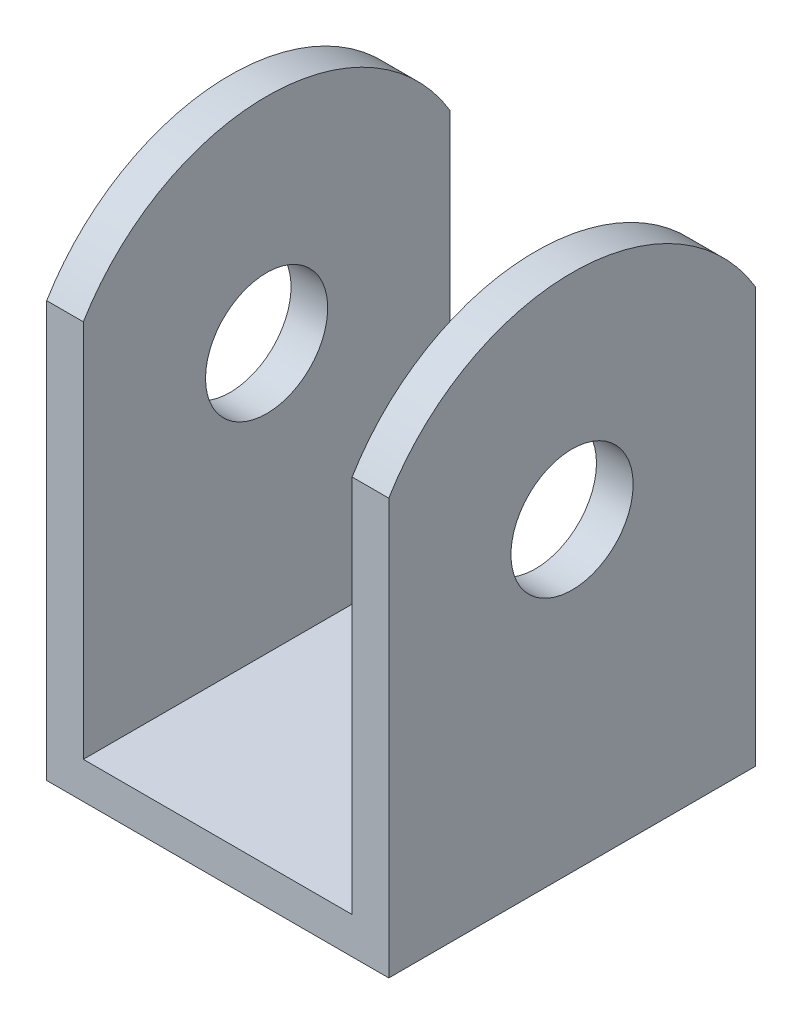
ISO-10303-21;
HEADER;
FILE_DESCRIPTION(('STEP AP214'),'2;1');
FILE_NAME('part.step','',(''),(''),'','','');
FILE_SCHEMA(('AUTOMOTIVE_DESIGN { 1 0 10303 214 1 1 1 1 }'));
ENDSEC;
DATA;
#1=APPLICATION_CONTEXT('core data for automotive mechanical design processes');
#2=APPLICATION_PROTOCOL_DEFINITION('international standard','automotive_design',2000,#1);
#3=PRODUCT_CONTEXT('',#1,'mechanical');
#4=PRODUCT('Part','Part','',(#3));
#5=PRODUCT_RELATED_PRODUCT_CATEGORY('part','',(#4));
#6=PRODUCT_DEFINITION_FORMATION('','',#4);
#7=PRODUCT_DEFINITION_CONTEXT('part definition',#1,'design');
#8=PRODUCT_DEFINITION('design','',#6,#7);
#9=PRODUCT_DEFINITION_SHAPE('','',#8);
#10=(LENGTH_UNIT() NAMED_UNIT(*) SI_UNIT(.MILLI.,.METRE.));
#11=(NAMED_UNIT(*) PLANE_ANGLE_UNIT() SI_UNIT($,.RADIAN.));
#12=(NAMED_UNIT(*) SI_UNIT($,.STERADIAN.) SOLID_ANGLE_UNIT());
#13=UNCERTAINTY_MEASURE_WITH_UNIT(LENGTH_MEASURE(1.E-05),#10,'distance_accuracy_value','');
#14=(GEOMETRIC_REPRESENTATION_CONTEXT(3) GLOBAL_UNCERTAINTY_ASSIGNED_CONTEXT((#13)) GLOBAL_UNIT_ASSIGNED_CONTEXT((#10,
#11,#12)) REPRESENTATION_CONTEXT('',''));
#15=CARTESIAN_POINT('',(0.,0.,0.));
#16=DIRECTION('',(0.,0.,1.));
#17=DIRECTION('',(1.,0.,0.));
#18=AXIS2_PLACEMENT_3D('',#15,#16,#17);
#19=CARTESIAN_POINT('',(0.,3.,0.));
#20=DIRECTION('',(0.,1.,0.));
#21=DIRECTION('',(0.,0.,1.));
#22=AXIS2_PLACEMENT_3D('',#19,#20,#21);
#23=PLANE('',#22);
#24=DIRECTION('',(-1.,0.,0.));
#25=VECTOR('',#24,1.);
#26=CARTESIAN_POINT('',(0.,3.,15.0813953488372));
#27=LINE('',#26,#25);
#28=CARTESIAN_POINT('',(-34.1860465116279,3.,15.0813953488372));
#29=VERTEX_POINT('',#28);
#30=CARTESIAN_POINT('',(-56.1860465116279,3.,15.0813953488372));
#31=VERTEX_POINT('',#30);
#32=EDGE_CURVE('E68',#29,#31,#27,.T.);
#33=ORIENTED_EDGE('',*,*,#32,.F.);
#34=DIRECTION('',(0.,0.,-1.));
#35=VECTOR('',#34,1.);
#36=CARTESIAN_POINT('',(-34.186046511628,3.,-17.4186046511628));
#37=LINE('',#36,#35);
#38=CARTESIAN_POINT('',(-34.1860465116279,3.,-14.9186046511628));
#39=VERTEX_POINT('',#38);
#40=EDGE_CURVE('E164',#29,#39,#37,.T.);
#41=ORIENTED_EDGE('',*,*,#40,.T.);
#42=DIRECTION('',(1.,0.,0.));
#43=VECTOR('',#42,1.);
#44=CARTESIAN_POINT('',(0.,3.,-14.9186046511628));
#45=LINE('',#44,#43);
#46=CARTESIAN_POINT('',(-56.186046511628,3.,-14.9186046511628));
#47=VERTEX_POINT('',#46);
#48=EDGE_CURVE('E200',#47,#39,#45,.T.);
#49=ORIENTED_EDGE('',*,*,#48,.F.);
#50=DIRECTION('',(0.,0.,1.));
#51=VECTOR('',#50,1.);
#52=CARTESIAN_POINT('',(-56.186046511628,3.,-17.4186046511628));
#53=LINE('',#52,#51);
#54=EDGE_CURVE('E157',#47,#31,#53,.T.);
#55=ORIENTED_EDGE('',*,*,#54,.T.);
#56=EDGE_LOOP('',(#33,#41,#49,#55));
#57=FACE_BOUND('',#56,.T.);
#58=ADVANCED_FACE('F45',(#57),#23,.T.);
#59=CARTESIAN_POINT('',(0.,0.,0.));
#60=DIRECTION('',(0.,1.,0.));
#61=DIRECTION('',(0.,0.,1.));
#62=AXIS2_PLACEMENT_3D('',#59,#60,#61);
#63=PLANE('',#62);
#64=DIRECTION('',(0.,0.,-1.));
#65=VECTOR('',#64,1.);
#66=CARTESIAN_POINT('',(-31.186046511628,0.,0.));
#67=LINE('',#66,#65);
#68=CARTESIAN_POINT('',(-31.1860465116279,0.,15.0813953488372));
#69=VERTEX_POINT('',#68);
#70=CARTESIAN_POINT('',(-31.186046511628,0.,-14.9186046511628));
#71=VERTEX_POINT('',#70);
#72=EDGE_CURVE('E126',#69,#71,#67,.T.);
#73=ORIENTED_EDGE('',*,*,#72,.F.);
#74=DIRECTION('',(1.,0.,0.));
#75=VECTOR('',#74,1.);
#76=CARTESIAN_POINT('',(-59.186046511628,0.,15.0813953488372));
#77=LINE('',#76,#75);
#78=CARTESIAN_POINT('',(-59.186046511628,0.,15.0813953488372));
#79=VERTEX_POINT('',#78);
#80=EDGE_CURVE('E110',#79,#69,#77,.T.);
#81=ORIENTED_EDGE('',*,*,#80,.F.);
#82=DIRECTION('',(0.,0.,1.));
#83=VECTOR('',#82,1.);
#84=CARTESIAN_POINT('',(-59.186046511628,0.,0.));
#85=LINE('',#84,#83);
#86=CARTESIAN_POINT('',(-59.186046511628,0.,-14.9186046511628));
#87=VERTEX_POINT('',#86);
#88=EDGE_CURVE('E124',#87,#79,#85,.T.);
#89=ORIENTED_EDGE('',*,*,#88,.F.);
#90=DIRECTION('',(-1.,0.,0.));
#91=VECTOR('',#90,1.);
#92=CARTESIAN_POINT('',(-59.186046511628,0.,-14.9186046511628));
#93=LINE('',#92,#91);
#94=EDGE_CURVE('E127',#71,#87,#93,.T.);
#95=ORIENTED_EDGE('',*,*,#94,.F.);
#96=EDGE_LOOP('',(#73,#81,#89,#95));
#97=FACE_BOUND('',#96,.T.);
#98=ADVANCED_FACE('F47',(#97),#63,.F.);
#99=CARTESIAN_POINT('',(-31.186046511628,25.,0.0813953488372125));
#100=DIRECTION('',(-1.,0.,0.));
#101=DIRECTION('',(0.,0.,1.));
#102=AXIS2_PLACEMENT_3D('',#99,#100,#101);
#103=CYLINDRICAL_SURFACE('',#102,17.5);
#104=CARTESIAN_POINT('',(-34.1860465116279,25.,0.0813953488372137));
#105=DIRECTION('',(1.,0.,0.));
#106=DIRECTION('',(0.,0.,-1.));
#107=AXIS2_PLACEMENT_3D('',#104,#105,#106);
#108=CIRCLE('',#107,17.5);
#109=CARTESIAN_POINT('',(-34.186046511628,34.01387818866,-14.9186046511628));
#110=VERTEX_POINT('',#109);
#111=CARTESIAN_POINT('',(-34.1860465116279,34.01387818866,15.0813953488372));
#112=VERTEX_POINT('',#111);
#113=EDGE_CURVE('E137',#110,#112,#108,.T.);
#114=ORIENTED_EDGE('',*,*,#113,.T.);
#115=DIRECTION('',(-1.,0.,0.));
#116=VECTOR('',#115,1.);
#117=CARTESIAN_POINT('',(-31.186046511628,34.01387818866,15.0813953488372));
#118=LINE('',#117,#116);
#119=CARTESIAN_POINT('',(-31.1860465116279,34.01387818866,15.0813953488372));
#120=VERTEX_POINT('',#119);
#121=EDGE_CURVE('E146',#112,#120,#118,.F.);
#122=ORIENTED_EDGE('',*,*,#121,.T.);
#123=CARTESIAN_POINT('',(-31.186046511628,25.,0.0813953488372125));
#124=DIRECTION('',(1.,0.,0.));
#125=DIRECTION('',(0.,0.,-1.));
#126=AXIS2_PLACEMENT_3D('',#123,#124,#125);
#127=CIRCLE('',#126,17.5);
#128=CARTESIAN_POINT('',(-31.186046511628,34.01387818866,-14.9186046511628));
#129=VERTEX_POINT('',#128);
#130=EDGE_CURVE('E149',#129,#120,#127,.T.);
#131=ORIENTED_EDGE('',*,*,#130,.F.);
#132=DIRECTION('',(-1.,0.,0.));
#133=VECTOR('',#132,1.);
#134=CARTESIAN_POINT('',(-31.186046511628,34.01387818866,-14.9186046511628));
#135=LINE('',#134,#133);
#136=EDGE_CURVE('E174',#129,#110,#135,.T.);
#137=ORIENTED_EDGE('',*,*,#136,.T.);
#138=EDGE_LOOP('',(#114,#122,#131,#137));
#139=FACE_BOUND('',#138,.T.);
#140=ADVANCED_FACE('F187',(#139),#103,.T.);
#141=CARTESIAN_POINT('',(-31.186046511628,25.,0.0813953488372125));
#142=DIRECTION('',(-1.,0.,0.));
#143=DIRECTION('',(0.,0.,1.));
#144=AXIS2_PLACEMENT_3D('',#141,#142,#143);
#145=CYLINDRICAL_SURFACE('',#144,5.);
#146=CARTESIAN_POINT('',(-31.186046511628,25.,0.0813953488372125));
#147=DIRECTION('',(1.,0.,0.));
#148=DIRECTION('',(0.,0.,-1.));
#149=AXIS2_PLACEMENT_3D('',#146,#147,#148);
#150=CIRCLE('',#149,5.);
#151=CARTESIAN_POINT('',(-31.186046511628,25.,-4.91860465116279));
#152=VERTEX_POINT('',#151);
#153=EDGE_CURVE('E154',#152,#152,#150,.T.);
#154=ORIENTED_EDGE('',*,*,#153,.T.);
#155=EDGE_LOOP('',(#154));
#156=FACE_BOUND('',#155,.T.);
#157=CARTESIAN_POINT('',(-34.1860465116279,25.,0.0813953488372137));
#158=DIRECTION('',(1.,0.,0.));
#159=DIRECTION('',(0.,0.,-1.));
#160=AXIS2_PLACEMENT_3D('',#157,#158,#159);
#161=CIRCLE('',#160,5.);
#162=CARTESIAN_POINT('',(-34.1860465116279,25.,-4.91860465116279));
#163=VERTEX_POINT('',#162);
#164=EDGE_CURVE('E152',#163,#163,#161,.T.);
#165=ORIENTED_EDGE('',*,*,#164,.F.);
#166=EDGE_LOOP('',(#165));
#167=FACE_BOUND('',#166,.T.);
#168=ADVANCED_FACE('F225',(#156,#167),#145,.F.);
#169=CARTESIAN_POINT('',(-31.186046511628,0.,0.));
#170=DIRECTION('',(1.,0.,0.));
#171=DIRECTION('',(0.,0.,-1.));
#172=AXIS2_PLACEMENT_3D('',#169,#170,#171);
#173=PLANE('',#172);
#174=DIRECTION('',(0.,-1.,0.));
#175=VECTOR('',#174,1.);
#176=CARTESIAN_POINT('',(-31.1860465116279,50.,15.0813953488372));
#177=LINE('',#176,#175);
#178=EDGE_CURVE('E118',#120,#69,#177,.T.);
#179=ORIENTED_EDGE('',*,*,#178,.T.);
#180=ORIENTED_EDGE('',*,*,#72,.T.);
#181=DIRECTION('',(0.,-1.,0.));
#182=VECTOR('',#181,1.);
#183=CARTESIAN_POINT('',(-31.186046511628,50.,-14.9186046511628));
#184=LINE('',#183,#182);
#185=EDGE_CURVE('E193',#129,#71,#184,.T.);
#186=ORIENTED_EDGE('',*,*,#185,.F.);
#187=ORIENTED_EDGE('',*,*,#130,.T.);
#188=EDGE_LOOP('',(#179,#180,#186,#187));
#189=FACE_BOUND('',#188,.T.);
#190=ORIENTED_EDGE('',*,*,#153,.F.);
#191=EDGE_LOOP('',(#190));
#192=FACE_BOUND('',#191,.T.);
#193=ADVANCED_FACE('F191',(#189,#192),#173,.T.);
#194=CARTESIAN_POINT('',(-34.1860465116279,0.,0.));
#195=DIRECTION('',(1.,0.,0.));
#196=DIRECTION('',(0.,0.,-1.));
#197=AXIS2_PLACEMENT_3D('',#194,#195,#196);
#198=PLANE('',#197);
#199=ORIENTED_EDGE('',*,*,#40,.F.);
#200=DIRECTION('',(0.,1.,0.));
#201=VECTOR('',#200,1.);
#202=CARTESIAN_POINT('',(-34.1860465116279,0.,15.0813953488372));
#203=LINE('',#202,#201);
#204=EDGE_CURVE('E176',#29,#112,#203,.T.);
#205=ORIENTED_EDGE('',*,*,#204,.T.);
#206=ORIENTED_EDGE('',*,*,#113,.F.);
#207=DIRECTION('',(0.,-1.,0.));
#208=VECTOR('',#207,1.);
#209=CARTESIAN_POINT('',(-34.186046511628,0.,-14.9186046511628));
#210=LINE('',#209,#208);
#211=EDGE_CURVE('E179',#110,#39,#210,.T.);
#212=ORIENTED_EDGE('',*,*,#211,.T.);
#213=EDGE_LOOP('',(#199,#205,#206,#212));
#214=FACE_BOUND('',#213,.T.);
#215=ORIENTED_EDGE('',*,*,#164,.T.);
#216=EDGE_LOOP('',(#215));
#217=FACE_BOUND('',#216,.T.);
#218=ADVANCED_FACE('F204',(#214,#217),#198,.F.);
#219=CARTESIAN_POINT('',(-59.186046511628,25.,0.0813953488372119));
#220=DIRECTION('',(1.,0.,0.));
#221=DIRECTION('',(0.,0.,-1.));
#222=AXIS2_PLACEMENT_3D('',#219,#220,#221);
#223=CYLINDRICAL_SURFACE('',#222,17.5);
#224=CARTESIAN_POINT('',(-59.186046511628,25.,0.0813953488372119));
#225=DIRECTION('',(-1.,0.,0.));
#226=DIRECTION('',(0.,0.,1.));
#227=AXIS2_PLACEMENT_3D('',#224,#225,#226);
#228=CIRCLE('',#227,17.5);
#229=CARTESIAN_POINT('',(-59.186046511628,34.01387818866,15.0813953488372));
#230=VERTEX_POINT('',#229);
#231=CARTESIAN_POINT('',(-59.186046511628,34.01387818866,-14.9186046511628));
#232=VERTEX_POINT('',#231);
#233=EDGE_CURVE('E134',#230,#232,#228,.T.);
#234=ORIENTED_EDGE('',*,*,#233,.F.);
#235=DIRECTION('',(1.,0.,0.));
#236=VECTOR('',#235,1.);
#237=CARTESIAN_POINT('',(-59.186046511628,34.01387818866,15.0813953488372));
#238=LINE('',#237,#236);
#239=CARTESIAN_POINT('',(-56.186046511628,34.01387818866,15.0813953488372));
#240=VERTEX_POINT('',#239);
#241=EDGE_CURVE('E113',#230,#240,#238,.T.);
#242=ORIENTED_EDGE('',*,*,#241,.T.);
#243=CARTESIAN_POINT('',(-56.186046511628,25.,0.0813953488372113));
#244=DIRECTION('',(-1.,0.,0.));
#245=DIRECTION('',(0.,0.,1.));
#246=AXIS2_PLACEMENT_3D('',#243,#244,#245);
#247=CIRCLE('',#246,17.5);
#248=CARTESIAN_POINT('',(-56.186046511628,34.01387818866,-14.9186046511628));
#249=VERTEX_POINT('',#248);
#250=EDGE_CURVE('E143',#240,#249,#247,.T.);
#251=ORIENTED_EDGE('',*,*,#250,.T.);
#252=DIRECTION('',(1.,0.,0.));
#253=VECTOR('',#252,1.);
#254=CARTESIAN_POINT('',(-59.186046511628,34.01387818866,-14.9186046511628));
#255=LINE('',#254,#253);
#256=EDGE_CURVE('E60',#249,#232,#255,.F.);
#257=ORIENTED_EDGE('',*,*,#256,.T.);
#258=EDGE_LOOP('',(#234,#242,#251,#257));
#259=FACE_BOUND('',#258,.T.);
#260=ADVANCED_FACE('F173',(#259),#223,.T.);
#261=CARTESIAN_POINT('',(-59.186046511628,25.,0.0813953488372119));
#262=DIRECTION('',(1.,0.,0.));
#263=DIRECTION('',(0.,0.,-1.));
#264=AXIS2_PLACEMENT_3D('',#261,#262,#263);
#265=CYLINDRICAL_SURFACE('',#264,5.);
#266=CARTESIAN_POINT('',(-59.186046511628,25.,0.0813953488372119));
#267=DIRECTION('',(-1.,0.,0.));
#268=DIRECTION('',(0.,0.,1.));
#269=AXIS2_PLACEMENT_3D('',#266,#267,#268);
#270=CIRCLE('',#269,5.);
#271=CARTESIAN_POINT('',(-59.186046511628,25.,5.08139534883721));
#272=VERTEX_POINT('',#271);
#273=EDGE_CURVE('E133',#272,#272,#270,.T.);
#274=ORIENTED_EDGE('',*,*,#273,.T.);
#275=EDGE_LOOP('',(#274));
#276=FACE_BOUND('',#275,.T.);
#277=CARTESIAN_POINT('',(-56.186046511628,25.,0.0813953488372113));
#278=DIRECTION('',(-1.,0.,0.));
#279=DIRECTION('',(0.,0.,1.));
#280=AXIS2_PLACEMENT_3D('',#277,#278,#279);
#281=CIRCLE('',#280,5.);
#282=CARTESIAN_POINT('',(-56.186046511628,25.,5.08139534883721));
#283=VERTEX_POINT('',#282);
#284=EDGE_CURVE('E139',#283,#283,#281,.T.);
#285=ORIENTED_EDGE('',*,*,#284,.F.);
#286=EDGE_LOOP('',(#285));
#287=FACE_BOUND('',#286,.T.);
#288=ADVANCED_FACE('F235',(#276,#287),#265,.F.);
#289=CARTESIAN_POINT('',(-59.186046511628,0.,0.));
#290=DIRECTION('',(-1.,0.,0.));
#291=DIRECTION('',(0.,0.,1.));
#292=AXIS2_PLACEMENT_3D('',#289,#290,#291);
#293=PLANE('',#292);
#294=DIRECTION('',(0.,-1.,0.));
#295=VECTOR('',#294,1.);
#296=CARTESIAN_POINT('',(-59.186046511628,50.,15.0813953488372));
#297=LINE('',#296,#295);
#298=EDGE_CURVE('E107',#230,#79,#297,.T.);
#299=ORIENTED_EDGE('',*,*,#298,.F.);
#300=ORIENTED_EDGE('',*,*,#233,.T.);
#301=DIRECTION('',(0.,-1.,0.));
#302=VECTOR('',#301,1.);
#303=CARTESIAN_POINT('',(-59.186046511628,50.,-14.9186046511628));
#304=LINE('',#303,#302);
#305=EDGE_CURVE('E132',#232,#87,#304,.T.);
#306=ORIENTED_EDGE('',*,*,#305,.T.);
#307=ORIENTED_EDGE('',*,*,#88,.T.);
#308=EDGE_LOOP('',(#299,#300,#306,#307));
#309=FACE_BOUND('',#308,.T.);
#310=ORIENTED_EDGE('',*,*,#273,.F.);
#311=EDGE_LOOP('',(#310));
#312=FACE_BOUND('',#311,.T.);
#313=ADVANCED_FACE('F130',(#309,#312),#293,.T.);
#314=CARTESIAN_POINT('',(-56.186046511628,0.,0.));
#315=DIRECTION('',(-1.,0.,0.));
#316=DIRECTION('',(0.,0.,1.));
#317=AXIS2_PLACEMENT_3D('',#314,#315,#316);
#318=PLANE('',#317);
#319=ORIENTED_EDGE('',*,*,#250,.F.);
#320=DIRECTION('',(0.,-1.,0.));
#321=VECTOR('',#320,1.);
#322=CARTESIAN_POINT('',(-56.186046511628,0.,15.0813953488372));
#323=LINE('',#322,#321);
#324=EDGE_CURVE('E11',#240,#31,#323,.T.);
#325=ORIENTED_EDGE('',*,*,#324,.T.);
#326=ORIENTED_EDGE('',*,*,#54,.F.);
#327=DIRECTION('',(0.,1.,0.));
#328=VECTOR('',#327,1.);
#329=CARTESIAN_POINT('',(-56.186046511628,0.,-14.9186046511628));
#330=LINE('',#329,#328);
#331=EDGE_CURVE('E53',#47,#249,#330,.T.);
#332=ORIENTED_EDGE('',*,*,#331,.T.);
#333=EDGE_LOOP('',(#319,#325,#326,#332));
#334=FACE_BOUND('',#333,.T.);
#335=ORIENTED_EDGE('',*,*,#284,.T.);
#336=EDGE_LOOP('',(#335));
#337=FACE_BOUND('',#336,.T.);
#338=ADVANCED_FACE('F169',(#334,#337),#318,.F.);
#339=CARTESIAN_POINT('',(-59.186046511628,50.,-14.9186046511628));
#340=DIRECTION('',(0.,0.,1.));
#341=DIRECTION('',(1.,0.,0.));
#342=AXIS2_PLACEMENT_3D('',#339,#340,#341);
#343=PLANE('',#342);
#344=ORIENTED_EDGE('',*,*,#185,.T.);
#345=ORIENTED_EDGE('',*,*,#94,.T.);
#346=ORIENTED_EDGE('',*,*,#305,.F.);
#347=ORIENTED_EDGE('',*,*,#256,.F.);
#348=ORIENTED_EDGE('',*,*,#331,.F.);
#349=ORIENTED_EDGE('',*,*,#48,.T.);
#350=ORIENTED_EDGE('',*,*,#211,.F.);
#351=ORIENTED_EDGE('',*,*,#136,.F.);
#352=EDGE_LOOP('',(#344,#345,#346,#347,#348,#349,#350,#351));
#353=FACE_BOUND('',#352,.T.);
#354=ADVANCED_FACE('F207',(#353),#343,.F.);
#355=CARTESIAN_POINT('',(-59.186046511628,50.,15.0813953488372));
#356=DIRECTION('',(0.,0.,-1.));
#357=DIRECTION('',(-1.,0.,0.));
#358=AXIS2_PLACEMENT_3D('',#355,#356,#357);
#359=PLANE('',#358);
#360=ORIENTED_EDGE('',*,*,#204,.F.);
#361=ORIENTED_EDGE('',*,*,#32,.T.);
#362=ORIENTED_EDGE('',*,*,#324,.F.);
#363=ORIENTED_EDGE('',*,*,#241,.F.);
#364=ORIENTED_EDGE('',*,*,#298,.T.);
#365=ORIENTED_EDGE('',*,*,#80,.T.);
#366=ORIENTED_EDGE('',*,*,#178,.F.);
#367=ORIENTED_EDGE('',*,*,#121,.F.);
#368=EDGE_LOOP('',(#360,#361,#362,#363,#364,#365,#366,#367));
#369=FACE_BOUND('',#368,.T.);
#370=ADVANCED_FACE('F109',(#369),#359,.F.);
#371=CLOSED_SHELL('',(#58,#98,#140,#168,#193,#218,#260,#288,#313,#338,#354,#370));
#372=MANIFOLD_SOLID_BREP('B2',#371);
#373=ADVANCED_BREP_SHAPE_REPRESENTATION('',(#18,#372),#14);
#374=SHAPE_DEFINITION_REPRESENTATION(#9,#373);
ENDSEC;
END-ISO-10303-21;
